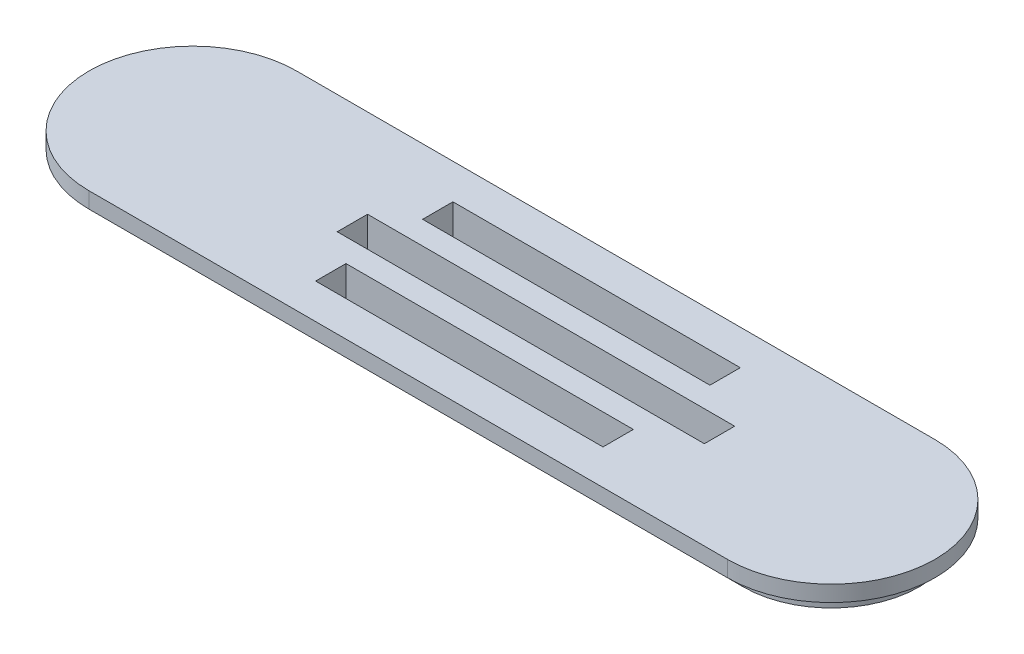
ISO-10303-21;
HEADER;
FILE_DESCRIPTION(('STEP AP214'),'2;1');
FILE_NAME('part.step','',(''),(''),'','','');
FILE_SCHEMA(('AUTOMOTIVE_DESIGN { 1 0 10303 214 1 1 1 1 }'));
ENDSEC;
DATA;
#1=APPLICATION_CONTEXT('core data for automotive mechanical design processes');
#2=APPLICATION_PROTOCOL_DEFINITION('international standard','automotive_design',2000,#1);
#3=PRODUCT_CONTEXT('',#1,'mechanical');
#4=PRODUCT('Part','Part','',(#3));
#5=PRODUCT_RELATED_PRODUCT_CATEGORY('part','',(#4));
#6=PRODUCT_DEFINITION_FORMATION('','',#4);
#7=PRODUCT_DEFINITION_CONTEXT('part definition',#1,'design');
#8=PRODUCT_DEFINITION('design','',#6,#7);
#9=PRODUCT_DEFINITION_SHAPE('','',#8);
#10=(LENGTH_UNIT() NAMED_UNIT(*) SI_UNIT(.MILLI.,.METRE.));
#11=(NAMED_UNIT(*) PLANE_ANGLE_UNIT() SI_UNIT($,.RADIAN.));
#12=(NAMED_UNIT(*) SI_UNIT($,.STERADIAN.) SOLID_ANGLE_UNIT());
#13=UNCERTAINTY_MEASURE_WITH_UNIT(LENGTH_MEASURE(1.E-05),#10,'distance_accuracy_value','');
#14=(GEOMETRIC_REPRESENTATION_CONTEXT(3) GLOBAL_UNCERTAINTY_ASSIGNED_CONTEXT((#13)) GLOBAL_UNIT_ASSIGNED_CONTEXT((#10,
#11,#12)) REPRESENTATION_CONTEXT('',''));
#15=CARTESIAN_POINT('',(0.,0.,0.));
#16=DIRECTION('',(0.,0.,1.));
#17=DIRECTION('',(1.,0.,0.));
#18=AXIS2_PLACEMENT_3D('',#15,#16,#17);
#19=CARTESIAN_POINT('',(-100.,10.,0.));
#20=DIRECTION('',(0.,-1.,0.));
#21=DIRECTION('',(0.,0.,-1.));
#22=AXIS2_PLACEMENT_3D('',#19,#20,#21);
#23=CYLINDRICAL_SURFACE('',#22,32.5);
#24=CARTESIAN_POINT('',(-100.,5.,0.));
#25=DIRECTION('',(0.,1.,0.));
#26=DIRECTION('',(0.,0.,-1.));
#27=AXIS2_PLACEMENT_3D('',#24,#25,#26);
#28=CIRCLE('',#27,32.5);
#29=CARTESIAN_POINT('',(-100.,5.,-32.5));
#30=VERTEX_POINT('',#29);
#31=CARTESIAN_POINT('',(-100.,5.,32.5));
#32=VERTEX_POINT('',#31);
#33=EDGE_CURVE('E62',#30,#32,#28,.T.);
#34=ORIENTED_EDGE('',*,*,#33,.T.);
#35=DIRECTION('',(0.,-1.,0.));
#36=VECTOR('',#35,1.);
#37=CARTESIAN_POINT('',(-100.,10.,32.5));
#38=LINE('',#37,#36);
#39=CARTESIAN_POINT('',(-100.,10.,32.5));
#40=VERTEX_POINT('',#39);
#41=EDGE_CURVE('E11',#40,#32,#38,.T.);
#42=ORIENTED_EDGE('',*,*,#41,.F.);
#43=CARTESIAN_POINT('',(-100.,10.,0.));
#44=DIRECTION('',(0.,1.,0.));
#45=DIRECTION('',(0.,0.,1.));
#46=AXIS2_PLACEMENT_3D('',#43,#44,#45);
#47=CIRCLE('',#46,32.5);
#48=CARTESIAN_POINT('',(-100.,10.,-32.5));
#49=VERTEX_POINT('',#48);
#50=EDGE_CURVE('E369',#49,#40,#47,.T.);
#51=ORIENTED_EDGE('',*,*,#50,.F.);
#52=DIRECTION('',(0.,-1.,0.));
#53=VECTOR('',#52,1.);
#54=CARTESIAN_POINT('',(-100.,10.,-32.5));
#55=LINE('',#54,#53);
#56=EDGE_CURVE('E382',#49,#30,#55,.T.);
#57=ORIENTED_EDGE('',*,*,#56,.T.);
#58=EDGE_LOOP('',(#34,#42,#51,#57));
#59=FACE_BOUND('',#58,.T.);
#60=ADVANCED_FACE('F39',(#59),#23,.T.);
#61=CARTESIAN_POINT('',(-100.,10.,32.5));
#62=DIRECTION('',(0.,0.,-1.));
#63=DIRECTION('',(-1.,0.,0.));
#64=AXIS2_PLACEMENT_3D('',#61,#62,#63);
#65=PLANE('',#64);
#66=DIRECTION('',(1.,0.,0.));
#67=VECTOR('',#66,1.);
#68=CARTESIAN_POINT('',(100.,5.,32.5));
#69=LINE('',#68,#67);
#70=CARTESIAN_POINT('',(100.,5.,32.5));
#71=VERTEX_POINT('',#70);
#72=EDGE_CURVE('E230',#32,#71,#69,.T.);
#73=ORIENTED_EDGE('',*,*,#72,.T.);
#74=DIRECTION('',(0.,-1.,0.));
#75=VECTOR('',#74,1.);
#76=CARTESIAN_POINT('',(100.,10.,32.5));
#77=LINE('',#76,#75);
#78=CARTESIAN_POINT('',(100.,10.,32.5));
#79=VERTEX_POINT('',#78);
#80=EDGE_CURVE('E47',#79,#71,#77,.T.);
#81=ORIENTED_EDGE('',*,*,#80,.F.);
#82=DIRECTION('',(1.,0.,0.));
#83=VECTOR('',#82,1.);
#84=CARTESIAN_POINT('',(-100.,10.,32.5));
#85=LINE('',#84,#83);
#86=EDGE_CURVE('E373',#40,#79,#85,.T.);
#87=ORIENTED_EDGE('',*,*,#86,.F.);
#88=ORIENTED_EDGE('',*,*,#41,.T.);
#89=EDGE_LOOP('',(#73,#81,#87,#88));
#90=FACE_BOUND('',#89,.T.);
#91=ADVANCED_FACE('F397',(#90),#65,.F.);
#92=CARTESIAN_POINT('',(100.,10.,0.));
#93=DIRECTION('',(0.,-1.,0.));
#94=DIRECTION('',(0.,0.,-1.));
#95=AXIS2_PLACEMENT_3D('',#92,#93,#94);
#96=CYLINDRICAL_SURFACE('',#95,32.5);
#97=CARTESIAN_POINT('',(100.,5.,0.));
#98=DIRECTION('',(0.,1.,0.));
#99=DIRECTION('',(0.,0.,-1.));
#100=AXIS2_PLACEMENT_3D('',#97,#98,#99);
#101=CIRCLE('',#100,32.5);
#102=CARTESIAN_POINT('',(100.,5.,-32.5));
#103=VERTEX_POINT('',#102);
#104=EDGE_CURVE('E234',#71,#103,#101,.T.);
#105=ORIENTED_EDGE('',*,*,#104,.T.);
#106=DIRECTION('',(0.,-1.,0.));
#107=VECTOR('',#106,1.);
#108=CARTESIAN_POINT('',(100.,10.,-32.5));
#109=LINE('',#108,#107);
#110=CARTESIAN_POINT('',(100.,10.,-32.5));
#111=VERTEX_POINT('',#110);
#112=EDGE_CURVE('E386',#111,#103,#109,.T.);
#113=ORIENTED_EDGE('',*,*,#112,.F.);
#114=CARTESIAN_POINT('',(100.,10.,0.));
#115=DIRECTION('',(0.,1.,0.));
#116=DIRECTION('',(0.,0.,-1.));
#117=AXIS2_PLACEMENT_3D('',#114,#115,#116);
#118=CIRCLE('',#117,32.5);
#119=EDGE_CURVE('E376',#79,#111,#118,.T.);
#120=ORIENTED_EDGE('',*,*,#119,.F.);
#121=ORIENTED_EDGE('',*,*,#80,.T.);
#122=EDGE_LOOP('',(#105,#113,#120,#121));
#123=FACE_BOUND('',#122,.T.);
#124=ADVANCED_FACE('F394',(#123),#96,.T.);
#125=CARTESIAN_POINT('',(-100.,10.,-32.5));
#126=DIRECTION('',(0.,0.,1.));
#127=DIRECTION('',(1.,0.,0.));
#128=AXIS2_PLACEMENT_3D('',#125,#126,#127);
#129=PLANE('',#128);
#130=DIRECTION('',(-1.,0.,0.));
#131=VECTOR('',#130,1.);
#132=CARTESIAN_POINT('',(-100.,5.,-32.5));
#133=LINE('',#132,#131);
#134=EDGE_CURVE('E238',#103,#30,#133,.T.);
#135=ORIENTED_EDGE('',*,*,#134,.T.);
#136=ORIENTED_EDGE('',*,*,#56,.F.);
#137=DIRECTION('',(-1.,0.,0.));
#138=VECTOR('',#137,1.);
#139=CARTESIAN_POINT('',(-100.,10.,-32.5));
#140=LINE('',#139,#138);
#141=EDGE_CURVE('E379',#111,#49,#140,.T.);
#142=ORIENTED_EDGE('',*,*,#141,.F.);
#143=ORIENTED_EDGE('',*,*,#112,.T.);
#144=EDGE_LOOP('',(#135,#136,#142,#143));
#145=FACE_BOUND('',#144,.T.);
#146=ADVANCED_FACE('F404',(#145),#129,.F.);
#147=CARTESIAN_POINT('',(-100.,10.,0.));
#148=DIRECTION('',(0.,1.,0.));
#149=DIRECTION('',(0.,0.,1.));
#150=AXIS2_PLACEMENT_3D('',#147,#148,#149);
#151=PLANE('',#150);
#152=ORIENTED_EDGE('',*,*,#50,.T.);
#153=ORIENTED_EDGE('',*,*,#86,.T.);
#154=ORIENTED_EDGE('',*,*,#119,.T.);
#155=ORIENTED_EDGE('',*,*,#141,.T.);
#156=EDGE_LOOP('',(#152,#153,#154,#155));
#157=FACE_BOUND('',#156,.T.);
#158=DIRECTION('',(0.,0.,1.));
#159=VECTOR('',#158,1.);
#160=CARTESIAN_POINT('',(-40.,10.,-21.5));
#161=LINE('',#160,#159);
#162=CARTESIAN_POINT('',(-40.,10.,-21.5));
#163=VERTEX_POINT('',#162);
#164=CARTESIAN_POINT('',(-40.,10.,-12.));
#165=VERTEX_POINT('',#164);
#166=EDGE_CURVE('E331',#163,#165,#161,.T.);
#167=ORIENTED_EDGE('',*,*,#166,.F.);
#168=DIRECTION('',(-1.,0.,0.));
#169=VECTOR('',#168,1.);
#170=CARTESIAN_POINT('',(50.,10.,-21.5));
#171=LINE('',#170,#169);
#172=CARTESIAN_POINT('',(50.,10.,-21.5));
#173=VERTEX_POINT('',#172);
#174=EDGE_CURVE('E328',#173,#163,#171,.T.);
#175=ORIENTED_EDGE('',*,*,#174,.F.);
#176=DIRECTION('',(0.,0.,-1.));
#177=VECTOR('',#176,1.);
#178=CARTESIAN_POINT('',(50.,10.,-12.));
#179=LINE('',#178,#177);
#180=CARTESIAN_POINT('',(50.,10.,-12.));
#181=VERTEX_POINT('',#180);
#182=EDGE_CURVE('E339',#181,#173,#179,.T.);
#183=ORIENTED_EDGE('',*,*,#182,.F.);
#184=DIRECTION('',(1.,0.,0.));
#185=VECTOR('',#184,1.);
#186=CARTESIAN_POINT('',(-40.,10.,-12.));
#187=LINE('',#186,#185);
#188=EDGE_CURVE('E335',#165,#181,#187,.T.);
#189=ORIENTED_EDGE('',*,*,#188,.F.);
#190=EDGE_LOOP('',(#167,#175,#183,#189));
#191=FACE_BOUND('',#190,.T.);
#192=DIRECTION('',(1.,0.,0.));
#193=VECTOR('',#192,1.);
#194=CARTESIAN_POINT('',(0.,10.,4.75));
#195=LINE('',#194,#193);
#196=CARTESIAN_POINT('',(-50.,10.,4.75000000000001));
#197=VERTEX_POINT('',#196);
#198=CARTESIAN_POINT('',(65.,10.,4.74999999999999));
#199=VERTEX_POINT('',#198);
#200=EDGE_CURVE('E287',#197,#199,#195,.T.);
#201=ORIENTED_EDGE('',*,*,#200,.F.);
#202=DIRECTION('',(0.,0.,1.));
#203=VECTOR('',#202,1.);
#204=CARTESIAN_POINT('',(-50.,10.,4.75000000000001));
#205=LINE('',#204,#203);
#206=CARTESIAN_POINT('',(-50.,10.,-4.75000000000001));
#207=VERTEX_POINT('',#206);
#208=EDGE_CURVE('E284',#207,#197,#205,.T.);
#209=ORIENTED_EDGE('',*,*,#208,.F.);
#210=DIRECTION('',(-1.,0.,0.));
#211=VECTOR('',#210,1.);
#212=CARTESIAN_POINT('',(0.,10.,-4.75000000000001));
#213=LINE('',#212,#211);
#214=CARTESIAN_POINT('',(65.,10.,-4.75000000000001));
#215=VERTEX_POINT('',#214);
#216=EDGE_CURVE('E295',#215,#207,#213,.T.);
#217=ORIENTED_EDGE('',*,*,#216,.F.);
#218=DIRECTION('',(0.,0.,-1.));
#219=VECTOR('',#218,1.);
#220=CARTESIAN_POINT('',(65.,10.,-4.75000000000001));
#221=LINE('',#220,#219);
#222=EDGE_CURVE('E291',#199,#215,#221,.T.);
#223=ORIENTED_EDGE('',*,*,#222,.F.);
#224=EDGE_LOOP('',(#201,#209,#217,#223));
#225=FACE_BOUND('',#224,.T.);
#226=DIRECTION('',(0.,0.,1.));
#227=VECTOR('',#226,1.);
#228=CARTESIAN_POINT('',(-40.,10.,12.));
#229=LINE('',#228,#227);
#230=CARTESIAN_POINT('',(-40.,10.,12.));
#231=VERTEX_POINT('',#230);
#232=CARTESIAN_POINT('',(-40.,10.,21.5));
#233=VERTEX_POINT('',#232);
#234=EDGE_CURVE('E245',#231,#233,#229,.T.);
#235=ORIENTED_EDGE('',*,*,#234,.F.);
#236=DIRECTION('',(-1.,0.,0.));
#237=VECTOR('',#236,1.);
#238=CARTESIAN_POINT('',(50.,10.,12.));
#239=LINE('',#238,#237);
#240=CARTESIAN_POINT('',(50.,10.,12.));
#241=VERTEX_POINT('',#240);
#242=EDGE_CURVE('E242',#241,#231,#239,.T.);
#243=ORIENTED_EDGE('',*,*,#242,.F.);
#244=DIRECTION('',(0.,0.,-1.));
#245=VECTOR('',#244,1.);
#246=CARTESIAN_POINT('',(50.,10.,21.5));
#247=LINE('',#246,#245);
#248=CARTESIAN_POINT('',(50.,10.,21.5));
#249=VERTEX_POINT('',#248);
#250=EDGE_CURVE('E253',#249,#241,#247,.T.);
#251=ORIENTED_EDGE('',*,*,#250,.F.);
#252=DIRECTION('',(1.,0.,0.));
#253=VECTOR('',#252,1.);
#254=CARTESIAN_POINT('',(-40.,10.,21.5));
#255=LINE('',#254,#253);
#256=EDGE_CURVE('E249',#233,#249,#255,.T.);
#257=ORIENTED_EDGE('',*,*,#256,.F.);
#258=EDGE_LOOP('',(#235,#243,#251,#257));
#259=FACE_BOUND('',#258,.T.);
#260=ADVANCED_FACE('F406',(#157,#191,#225,#259),#151,.T.);
#261=CARTESIAN_POINT('',(-100.,0.,0.));
#262=DIRECTION('',(0.,1.,0.));
#263=DIRECTION('',(0.,0.,1.));
#264=AXIS2_PLACEMENT_3D('',#261,#262,#263);
#265=PLANE('',#264);
#266=DIRECTION('',(1.,0.,0.));
#267=VECTOR('',#266,1.);
#268=CARTESIAN_POINT('',(-100.,0.,27.5));
#269=LINE('',#268,#267);
#270=CARTESIAN_POINT('',(-100.,0.,27.5));
#271=VERTEX_POINT('',#270);
#272=CARTESIAN_POINT('',(100.,0.,27.5));
#273=VERTEX_POINT('',#272);
#274=EDGE_CURVE('E213',#271,#273,#269,.T.);
#275=ORIENTED_EDGE('',*,*,#274,.F.);
#276=CARTESIAN_POINT('',(-99.9999999999998,0.,0.));
#277=DIRECTION('',(0.,1.,0.));
#278=DIRECTION('',(0.,0.,1.));
#279=AXIS2_PLACEMENT_3D('',#276,#277,#278);
#280=CIRCLE('',#279,27.5);
#281=CARTESIAN_POINT('',(-99.9999999999996,0.,-27.5));
#282=VERTEX_POINT('',#281);
#283=EDGE_CURVE('E193',#282,#271,#280,.T.);
#284=ORIENTED_EDGE('',*,*,#283,.F.);
#285=DIRECTION('',(-1.,0.,0.));
#286=VECTOR('',#285,1.);
#287=CARTESIAN_POINT('',(-99.9999999999996,0.,-27.5));
#288=LINE('',#287,#286);
#289=CARTESIAN_POINT('',(100.,0.,-27.5));
#290=VERTEX_POINT('',#289);
#291=EDGE_CURVE('E187',#290,#282,#288,.T.);
#292=ORIENTED_EDGE('',*,*,#291,.F.);
#293=CARTESIAN_POINT('',(100.,0.,0.));
#294=DIRECTION('',(0.,1.,0.));
#295=DIRECTION('',(0.,0.,-1.));
#296=AXIS2_PLACEMENT_3D('',#293,#294,#295);
#297=CIRCLE('',#296,27.5);
#298=EDGE_CURVE('E54',#273,#290,#297,.T.);
#299=ORIENTED_EDGE('',*,*,#298,.F.);
#300=EDGE_LOOP('',(#275,#284,#292,#299));
#301=FACE_BOUND('',#300,.T.);
#302=DIRECTION('',(0.,0.,1.));
#303=VECTOR('',#302,1.);
#304=CARTESIAN_POINT('',(-50.,0.,4.75000000000001));
#305=LINE('',#304,#303);
#306=CARTESIAN_POINT('',(-50.,0.,-4.75000000000001));
#307=VERTEX_POINT('',#306);
#308=CARTESIAN_POINT('',(-50.,0.,4.75000000000001));
#309=VERTEX_POINT('',#308);
#310=EDGE_CURVE('E283',#307,#309,#305,.T.);
#311=ORIENTED_EDGE('',*,*,#310,.T.);
#312=DIRECTION('',(1.,0.,0.));
#313=VECTOR('',#312,1.);
#314=CARTESIAN_POINT('',(65.,0.,4.74999999999999));
#315=LINE('',#314,#313);
#316=CARTESIAN_POINT('',(65.,0.,4.74999999999999));
#317=VERTEX_POINT('',#316);
#318=EDGE_CURVE('E302',#309,#317,#315,.T.);
#319=ORIENTED_EDGE('',*,*,#318,.T.);
#320=DIRECTION('',(0.,0.,-1.));
#321=VECTOR('',#320,1.);
#322=CARTESIAN_POINT('',(65.,0.,-4.75000000000001));
#323=LINE('',#322,#321);
#324=CARTESIAN_POINT('',(65.,0.,-4.75000000000001));
#325=VERTEX_POINT('',#324);
#326=EDGE_CURVE('E306',#317,#325,#323,.T.);
#327=ORIENTED_EDGE('',*,*,#326,.T.);
#328=DIRECTION('',(-1.,0.,0.));
#329=VECTOR('',#328,1.);
#330=CARTESIAN_POINT('',(-50.,0.,-4.75000000000001));
#331=LINE('',#330,#329);
#332=EDGE_CURVE('E288',#325,#307,#331,.T.);
#333=ORIENTED_EDGE('',*,*,#332,.T.);
#334=EDGE_LOOP('',(#311,#319,#327,#333));
#335=FACE_BOUND('',#334,.T.);
#336=DIRECTION('',(-1.,0.,0.));
#337=VECTOR('',#336,1.);
#338=CARTESIAN_POINT('',(0.,0.,-21.5));
#339=LINE('',#338,#337);
#340=CARTESIAN_POINT('',(50.,0.,-21.5));
#341=VERTEX_POINT('',#340);
#342=CARTESIAN_POINT('',(-40.,0.,-21.5));
#343=VERTEX_POINT('',#342);
#344=EDGE_CURVE('E327',#341,#343,#339,.T.);
#345=ORIENTED_EDGE('',*,*,#344,.T.);
#346=DIRECTION('',(0.,0.,1.));
#347=VECTOR('',#346,1.);
#348=CARTESIAN_POINT('',(-40.,0.,-21.5));
#349=LINE('',#348,#347);
#350=CARTESIAN_POINT('',(-40.,0.,-12.));
#351=VERTEX_POINT('',#350);
#352=EDGE_CURVE('E346',#343,#351,#349,.T.);
#353=ORIENTED_EDGE('',*,*,#352,.T.);
#354=DIRECTION('',(1.,0.,0.));
#355=VECTOR('',#354,1.);
#356=CARTESIAN_POINT('',(0.,0.,-12.));
#357=LINE('',#356,#355);
#358=CARTESIAN_POINT('',(50.,0.,-12.));
#359=VERTEX_POINT('',#358);
#360=EDGE_CURVE('E350',#351,#359,#357,.T.);
#361=ORIENTED_EDGE('',*,*,#360,.T.);
#362=DIRECTION('',(0.,0.,-1.));
#363=VECTOR('',#362,1.);
#364=CARTESIAN_POINT('',(50.,0.,-12.));
#365=LINE('',#364,#363);
#366=EDGE_CURVE('E332',#359,#341,#365,.T.);
#367=ORIENTED_EDGE('',*,*,#366,.T.);
#368=EDGE_LOOP('',(#345,#353,#361,#367));
#369=FACE_BOUND('',#368,.T.);
#370=DIRECTION('',(-1.,0.,0.));
#371=VECTOR('',#370,1.);
#372=CARTESIAN_POINT('',(0.,0.,12.));
#373=LINE('',#372,#371);
#374=CARTESIAN_POINT('',(50.,0.,12.));
#375=VERTEX_POINT('',#374);
#376=CARTESIAN_POINT('',(-40.,0.,12.));
#377=VERTEX_POINT('',#376);
#378=EDGE_CURVE('E241',#375,#377,#373,.T.);
#379=ORIENTED_EDGE('',*,*,#378,.T.);
#380=DIRECTION('',(0.,0.,1.));
#381=VECTOR('',#380,1.);
#382=CARTESIAN_POINT('',(-40.,0.,12.));
#383=LINE('',#382,#381);
#384=CARTESIAN_POINT('',(-40.,0.,21.5));
#385=VERTEX_POINT('',#384);
#386=EDGE_CURVE('E260',#377,#385,#383,.T.);
#387=ORIENTED_EDGE('',*,*,#386,.T.);
#388=DIRECTION('',(1.,0.,0.));
#389=VECTOR('',#388,1.);
#390=CARTESIAN_POINT('',(0.,0.,21.5));
#391=LINE('',#390,#389);
#392=CARTESIAN_POINT('',(50.,0.,21.5));
#393=VERTEX_POINT('',#392);
#394=EDGE_CURVE('E264',#385,#393,#391,.T.);
#395=ORIENTED_EDGE('',*,*,#394,.T.);
#396=DIRECTION('',(0.,0.,-1.));
#397=VECTOR('',#396,1.);
#398=CARTESIAN_POINT('',(50.,0.,21.5));
#399=LINE('',#398,#397);
#400=EDGE_CURVE('E246',#393,#375,#399,.T.);
#401=ORIENTED_EDGE('',*,*,#400,.T.);
#402=EDGE_LOOP('',(#379,#387,#395,#401));
#403=FACE_BOUND('',#402,.T.);
#404=ADVANCED_FACE('F409',(#301,#335,#369,#403),#265,.F.);
#405=CARTESIAN_POINT('',(0.,10.,-21.5));
#406=DIRECTION('',(0.,0.,1.));
#407=DIRECTION('',(1.,0.,0.));
#408=AXIS2_PLACEMENT_3D('',#405,#406,#407);
#409=PLANE('',#408);
#410=ORIENTED_EDGE('',*,*,#344,.F.);
#411=DIRECTION('',(0.,-1.,0.));
#412=VECTOR('',#411,1.);
#413=CARTESIAN_POINT('',(50.,10.,-21.5));
#414=LINE('',#413,#412);
#415=EDGE_CURVE('E342',#173,#341,#414,.T.);
#416=ORIENTED_EDGE('',*,*,#415,.F.);
#417=ORIENTED_EDGE('',*,*,#174,.T.);
#418=DIRECTION('',(0.,-1.,0.));
#419=VECTOR('',#418,1.);
#420=CARTESIAN_POINT('',(-40.,10.,-21.5));
#421=LINE('',#420,#419);
#422=EDGE_CURVE('E366',#163,#343,#421,.T.);
#423=ORIENTED_EDGE('',*,*,#422,.T.);
#424=EDGE_LOOP('',(#410,#416,#417,#423));
#425=FACE_BOUND('',#424,.T.);
#426=ADVANCED_FACE('F458',(#425),#409,.T.);
#427=CARTESIAN_POINT('',(-40.,10.,-21.5));
#428=DIRECTION('',(1.,0.,0.));
#429=DIRECTION('',(0.,0.,-1.));
#430=AXIS2_PLACEMENT_3D('',#427,#428,#429);
#431=PLANE('',#430);
#432=ORIENTED_EDGE('',*,*,#352,.F.);
#433=ORIENTED_EDGE('',*,*,#422,.F.);
#434=ORIENTED_EDGE('',*,*,#166,.T.);
#435=DIRECTION('',(0.,-1.,0.));
#436=VECTOR('',#435,1.);
#437=CARTESIAN_POINT('',(-40.,10.,-12.));
#438=LINE('',#437,#436);
#439=EDGE_CURVE('E362',#165,#351,#438,.T.);
#440=ORIENTED_EDGE('',*,*,#439,.T.);
#441=EDGE_LOOP('',(#432,#433,#434,#440));
#442=FACE_BOUND('',#441,.T.);
#443=ADVANCED_FACE('F463',(#442),#431,.T.);
#444=CARTESIAN_POINT('',(0.,10.,-12.));
#445=DIRECTION('',(0.,0.,-1.));
#446=DIRECTION('',(-1.,0.,0.));
#447=AXIS2_PLACEMENT_3D('',#444,#445,#446);
#448=PLANE('',#447);
#449=ORIENTED_EDGE('',*,*,#360,.F.);
#450=ORIENTED_EDGE('',*,*,#439,.F.);
#451=ORIENTED_EDGE('',*,*,#188,.T.);
#452=DIRECTION('',(0.,-1.,0.));
#453=VECTOR('',#452,1.);
#454=CARTESIAN_POINT('',(50.,10.,-12.));
#455=LINE('',#454,#453);
#456=EDGE_CURVE('E359',#181,#359,#455,.T.);
#457=ORIENTED_EDGE('',*,*,#456,.T.);
#458=EDGE_LOOP('',(#449,#450,#451,#457));
#459=FACE_BOUND('',#458,.T.);
#460=ADVANCED_FACE('F467',(#459),#448,.T.);
#461=CARTESIAN_POINT('',(50.,10.,-12.));
#462=DIRECTION('',(-1.,0.,0.));
#463=DIRECTION('',(0.,0.,1.));
#464=AXIS2_PLACEMENT_3D('',#461,#462,#463);
#465=PLANE('',#464);
#466=ORIENTED_EDGE('',*,*,#366,.F.);
#467=ORIENTED_EDGE('',*,*,#456,.F.);
#468=ORIENTED_EDGE('',*,*,#182,.T.);
#469=ORIENTED_EDGE('',*,*,#415,.T.);
#470=EDGE_LOOP('',(#466,#467,#468,#469));
#471=FACE_BOUND('',#470,.T.);
#472=ADVANCED_FACE('F471',(#471),#465,.T.);
#473=CARTESIAN_POINT('',(-50.,10.,4.75000000000001));
#474=DIRECTION('',(1.,0.,0.));
#475=DIRECTION('',(0.,0.,-1.));
#476=AXIS2_PLACEMENT_3D('',#473,#474,#475);
#477=PLANE('',#476);
#478=ORIENTED_EDGE('',*,*,#310,.F.);
#479=DIRECTION('',(0.,-1.,0.));
#480=VECTOR('',#479,1.);
#481=CARTESIAN_POINT('',(-50.,10.,-4.75000000000001));
#482=LINE('',#481,#480);
#483=EDGE_CURVE('E298',#207,#307,#482,.T.);
#484=ORIENTED_EDGE('',*,*,#483,.F.);
#485=ORIENTED_EDGE('',*,*,#208,.T.);
#486=DIRECTION('',(0.,-1.,0.));
#487=VECTOR('',#486,1.);
#488=CARTESIAN_POINT('',(-50.,10.,4.75000000000001));
#489=LINE('',#488,#487);
#490=EDGE_CURVE('E323',#197,#309,#489,.T.);
#491=ORIENTED_EDGE('',*,*,#490,.T.);
#492=EDGE_LOOP('',(#478,#484,#485,#491));
#493=FACE_BOUND('',#492,.T.);
#494=ADVANCED_FACE('F475',(#493),#477,.T.);
#495=CARTESIAN_POINT('',(65.,10.,4.74999999999999));
#496=DIRECTION('',(0.,0.,-1.));
#497=DIRECTION('',(-1.,0.,0.));
#498=AXIS2_PLACEMENT_3D('',#495,#496,#497);
#499=PLANE('',#498);
#500=ORIENTED_EDGE('',*,*,#318,.F.);
#501=ORIENTED_EDGE('',*,*,#490,.F.);
#502=ORIENTED_EDGE('',*,*,#200,.T.);
#503=DIRECTION('',(0.,-1.,0.));
#504=VECTOR('',#503,1.);
#505=CARTESIAN_POINT('',(65.,10.,4.74999999999999));
#506=LINE('',#505,#504);
#507=EDGE_CURVE('E320',#199,#317,#506,.T.);
#508=ORIENTED_EDGE('',*,*,#507,.T.);
#509=EDGE_LOOP('',(#500,#501,#502,#508));
#510=FACE_BOUND('',#509,.T.);
#511=ADVANCED_FACE('F479',(#510),#499,.T.);
#512=CARTESIAN_POINT('',(65.,10.,-4.75000000000001));
#513=DIRECTION('',(-1.,0.,0.));
#514=DIRECTION('',(0.,0.,1.));
#515=AXIS2_PLACEMENT_3D('',#512,#513,#514);
#516=PLANE('',#515);
#517=ORIENTED_EDGE('',*,*,#326,.F.);
#518=ORIENTED_EDGE('',*,*,#507,.F.);
#519=ORIENTED_EDGE('',*,*,#222,.T.);
#520=DIRECTION('',(0.,-1.,0.));
#521=VECTOR('',#520,1.);
#522=CARTESIAN_POINT('',(65.,10.,-4.75000000000001));
#523=LINE('',#522,#521);
#524=EDGE_CURVE('E316',#215,#325,#523,.T.);
#525=ORIENTED_EDGE('',*,*,#524,.T.);
#526=EDGE_LOOP('',(#517,#518,#519,#525));
#527=FACE_BOUND('',#526,.T.);
#528=ADVANCED_FACE('F483',(#527),#516,.T.);
#529=CARTESIAN_POINT('',(-50.,10.,-4.75000000000001));
#530=DIRECTION('',(0.,0.,1.));
#531=DIRECTION('',(1.,0.,0.));
#532=AXIS2_PLACEMENT_3D('',#529,#530,#531);
#533=PLANE('',#532);
#534=ORIENTED_EDGE('',*,*,#332,.F.);
#535=ORIENTED_EDGE('',*,*,#524,.F.);
#536=ORIENTED_EDGE('',*,*,#216,.T.);
#537=ORIENTED_EDGE('',*,*,#483,.T.);
#538=EDGE_LOOP('',(#534,#535,#536,#537));
#539=FACE_BOUND('',#538,.T.);
#540=ADVANCED_FACE('F487',(#539),#533,.T.);
#541=CARTESIAN_POINT('',(0.,10.,12.));
#542=DIRECTION('',(0.,0.,1.));
#543=DIRECTION('',(1.,0.,0.));
#544=AXIS2_PLACEMENT_3D('',#541,#542,#543);
#545=PLANE('',#544);
#546=ORIENTED_EDGE('',*,*,#378,.F.);
#547=DIRECTION('',(0.,-1.,0.));
#548=VECTOR('',#547,1.);
#549=CARTESIAN_POINT('',(50.,10.,12.));
#550=LINE('',#549,#548);
#551=EDGE_CURVE('E256',#241,#375,#550,.T.);
#552=ORIENTED_EDGE('',*,*,#551,.F.);
#553=ORIENTED_EDGE('',*,*,#242,.T.);
#554=DIRECTION('',(0.,-1.,0.));
#555=VECTOR('',#554,1.);
#556=CARTESIAN_POINT('',(-40.,10.,12.));
#557=LINE('',#556,#555);
#558=EDGE_CURVE('E280',#231,#377,#557,.T.);
#559=ORIENTED_EDGE('',*,*,#558,.T.);
#560=EDGE_LOOP('',(#546,#552,#553,#559));
#561=FACE_BOUND('',#560,.T.);
#562=ADVANCED_FACE('F435',(#561),#545,.T.);
#563=CARTESIAN_POINT('',(-40.,10.,12.));
#564=DIRECTION('',(1.,0.,0.));
#565=DIRECTION('',(0.,0.,-1.));
#566=AXIS2_PLACEMENT_3D('',#563,#564,#565);
#567=PLANE('',#566);
#568=ORIENTED_EDGE('',*,*,#386,.F.);
#569=ORIENTED_EDGE('',*,*,#558,.F.);
#570=ORIENTED_EDGE('',*,*,#234,.T.);
#571=DIRECTION('',(0.,-1.,0.));
#572=VECTOR('',#571,1.);
#573=CARTESIAN_POINT('',(-40.,10.,21.5));
#574=LINE('',#573,#572);
#575=EDGE_CURVE('E276',#233,#385,#574,.T.);
#576=ORIENTED_EDGE('',*,*,#575,.T.);
#577=EDGE_LOOP('',(#568,#569,#570,#576));
#578=FACE_BOUND('',#577,.T.);
#579=ADVANCED_FACE('F427',(#578),#567,.T.);
#580=CARTESIAN_POINT('',(0.,10.,21.5));
#581=DIRECTION('',(0.,0.,-1.));
#582=DIRECTION('',(-1.,0.,0.));
#583=AXIS2_PLACEMENT_3D('',#580,#581,#582);
#584=PLANE('',#583);
#585=ORIENTED_EDGE('',*,*,#394,.F.);
#586=ORIENTED_EDGE('',*,*,#575,.F.);
#587=ORIENTED_EDGE('',*,*,#256,.T.);
#588=DIRECTION('',(0.,-1.,0.));
#589=VECTOR('',#588,1.);
#590=CARTESIAN_POINT('',(50.,10.,21.5));
#591=LINE('',#590,#589);
#592=EDGE_CURVE('E273',#249,#393,#591,.T.);
#593=ORIENTED_EDGE('',*,*,#592,.T.);
#594=EDGE_LOOP('',(#585,#586,#587,#593));
#595=FACE_BOUND('',#594,.T.);
#596=ADVANCED_FACE('F429',(#595),#584,.T.);
#597=CARTESIAN_POINT('',(50.,10.,21.5));
#598=DIRECTION('',(-1.,0.,0.));
#599=DIRECTION('',(0.,0.,1.));
#600=AXIS2_PLACEMENT_3D('',#597,#598,#599);
#601=PLANE('',#600);
#602=ORIENTED_EDGE('',*,*,#400,.F.);
#603=ORIENTED_EDGE('',*,*,#592,.F.);
#604=ORIENTED_EDGE('',*,*,#250,.T.);
#605=ORIENTED_EDGE('',*,*,#551,.T.);
#606=EDGE_LOOP('',(#602,#603,#604,#605));
#607=FACE_BOUND('',#606,.T.);
#608=ADVANCED_FACE('F437',(#607),#601,.T.);
#609=CARTESIAN_POINT('',(-100.,5.,0.));
#610=DIRECTION('',(0.,-1.,0.));
#611=DIRECTION('',(0.,0.,-1.));
#612=AXIS2_PLACEMENT_3D('',#609,#610,#611);
#613=PLANE('',#612);
#614=ORIENTED_EDGE('',*,*,#33,.F.);
#615=ORIENTED_EDGE('',*,*,#134,.F.);
#616=ORIENTED_EDGE('',*,*,#104,.F.);
#617=ORIENTED_EDGE('',*,*,#72,.F.);
#618=EDGE_LOOP('',(#614,#615,#616,#617));
#619=FACE_BOUND('',#618,.T.);
#620=CARTESIAN_POINT('',(-99.9999999999998,5.,0.));
#621=DIRECTION('',(0.,1.,0.));
#622=DIRECTION('',(0.,0.,1.));
#623=AXIS2_PLACEMENT_3D('',#620,#621,#622);
#624=CIRCLE('',#623,27.5);
#625=CARTESIAN_POINT('',(-99.9999999999996,5.,-27.5));
#626=VERTEX_POINT('',#625);
#627=CARTESIAN_POINT('',(-100.,5.,27.5));
#628=VERTEX_POINT('',#627);
#629=EDGE_CURVE('E175',#626,#628,#624,.T.);
#630=ORIENTED_EDGE('',*,*,#629,.T.);
#631=DIRECTION('',(1.,0.,0.));
#632=VECTOR('',#631,1.);
#633=CARTESIAN_POINT('',(-100.,5.,27.5));
#634=LINE('',#633,#632);
#635=CARTESIAN_POINT('',(100.,5.,27.5));
#636=VERTEX_POINT('',#635);
#637=EDGE_CURVE('E180',#628,#636,#634,.T.);
#638=ORIENTED_EDGE('',*,*,#637,.T.);
#639=CARTESIAN_POINT('',(100.,5.,0.));
#640=DIRECTION('',(0.,1.,0.));
#641=DIRECTION('',(0.,0.,-1.));
#642=AXIS2_PLACEMENT_3D('',#639,#640,#641);
#643=CIRCLE('',#642,27.5);
#644=CARTESIAN_POINT('',(100.,5.,-27.5));
#645=VERTEX_POINT('',#644);
#646=EDGE_CURVE('E203',#636,#645,#643,.T.);
#647=ORIENTED_EDGE('',*,*,#646,.T.);
#648=DIRECTION('',(-1.,0.,0.));
#649=VECTOR('',#648,1.);
#650=CARTESIAN_POINT('',(-99.9999999999996,5.,-27.5));
#651=LINE('',#650,#649);
#652=EDGE_CURVE('E183',#645,#626,#651,.T.);
#653=ORIENTED_EDGE('',*,*,#652,.T.);
#654=EDGE_LOOP('',(#630,#638,#647,#653));
#655=FACE_BOUND('',#654,.T.);
#656=ADVANCED_FACE('F177',(#619,#655),#613,.T.);
#657=CARTESIAN_POINT('',(-99.9999999999998,5.,0.));
#658=DIRECTION('',(0.,-1.,0.));
#659=DIRECTION('',(0.,0.,-1.));
#660=AXIS2_PLACEMENT_3D('',#657,#658,#659);
#661=CYLINDRICAL_SURFACE('',#660,27.5);
#662=ORIENTED_EDGE('',*,*,#283,.T.);
#663=DIRECTION('',(0.,-1.,0.));
#664=VECTOR('',#663,1.);
#665=CARTESIAN_POINT('',(-100.,5.,27.5));
#666=LINE('',#665,#664);
#667=EDGE_CURVE('E190',#628,#271,#666,.T.);
#668=ORIENTED_EDGE('',*,*,#667,.F.);
#669=ORIENTED_EDGE('',*,*,#629,.F.);
#670=DIRECTION('',(0.,-1.,0.));
#671=VECTOR('',#670,1.);
#672=CARTESIAN_POINT('',(-99.9999999999996,5.,-27.5));
#673=LINE('',#672,#671);
#674=EDGE_CURVE('E210',#626,#282,#673,.T.);
#675=ORIENTED_EDGE('',*,*,#674,.T.);
#676=EDGE_LOOP('',(#662,#668,#669,#675));
#677=FACE_BOUND('',#676,.T.);
#678=ADVANCED_FACE('F191',(#677),#661,.T.);
#679=CARTESIAN_POINT('',(-100.,5.,27.5));
#680=DIRECTION('',(0.,0.,-1.));
#681=DIRECTION('',(-1.,0.,0.));
#682=AXIS2_PLACEMENT_3D('',#679,#680,#681);
#683=PLANE('',#682);
#684=ORIENTED_EDGE('',*,*,#274,.T.);
#685=DIRECTION('',(0.,-1.,0.));
#686=VECTOR('',#685,1.);
#687=CARTESIAN_POINT('',(100.,5.,27.5));
#688=LINE('',#687,#686);
#689=EDGE_CURVE('E198',#636,#273,#688,.T.);
#690=ORIENTED_EDGE('',*,*,#689,.F.);
#691=ORIENTED_EDGE('',*,*,#637,.F.);
#692=ORIENTED_EDGE('',*,*,#667,.T.);
#693=EDGE_LOOP('',(#684,#690,#691,#692));
#694=FACE_BOUND('',#693,.T.);
#695=ADVANCED_FACE('F200',(#694),#683,.F.);
#696=CARTESIAN_POINT('',(100.,5.,0.));
#697=DIRECTION('',(0.,-1.,0.));
#698=DIRECTION('',(0.,0.,-1.));
#699=AXIS2_PLACEMENT_3D('',#696,#697,#698);
#700=CYLINDRICAL_SURFACE('',#699,27.5);
#701=ORIENTED_EDGE('',*,*,#298,.T.);
#702=DIRECTION('',(0.,-1.,0.));
#703=VECTOR('',#702,1.);
#704=CARTESIAN_POINT('',(100.,5.,-27.5));
#705=LINE('',#704,#703);
#706=EDGE_CURVE('E223',#645,#290,#705,.T.);
#707=ORIENTED_EDGE('',*,*,#706,.F.);
#708=ORIENTED_EDGE('',*,*,#646,.F.);
#709=ORIENTED_EDGE('',*,*,#689,.T.);
#710=EDGE_LOOP('',(#701,#707,#708,#709));
#711=FACE_BOUND('',#710,.T.);
#712=ADVANCED_FACE('F559',(#711),#700,.T.);
#713=CARTESIAN_POINT('',(-99.9999999999996,5.,-27.5));
#714=DIRECTION('',(0.,0.,1.));
#715=DIRECTION('',(1.,0.,0.));
#716=AXIS2_PLACEMENT_3D('',#713,#714,#715);
#717=PLANE('',#716);
#718=ORIENTED_EDGE('',*,*,#291,.T.);
#719=ORIENTED_EDGE('',*,*,#674,.F.);
#720=ORIENTED_EDGE('',*,*,#652,.F.);
#721=ORIENTED_EDGE('',*,*,#706,.T.);
#722=EDGE_LOOP('',(#718,#719,#720,#721));
#723=FACE_BOUND('',#722,.T.);
#724=ADVANCED_FACE('F568',(#723),#717,.F.);
#725=CLOSED_SHELL('',(#60,#91,#124,#146,#260,#404,#426,#443,#460,#472,#494,#511,#528,#540,#562,
#579,#596,#608,#656,#678,#695,#712,#724));
#726=MANIFOLD_SOLID_BREP('B2',#725);
#727=ADVANCED_BREP_SHAPE_REPRESENTATION('',(#18,#726),#14);
#728=SHAPE_DEFINITION_REPRESENTATION(#9,#727);
ENDSEC;
END-ISO-10303-21;
